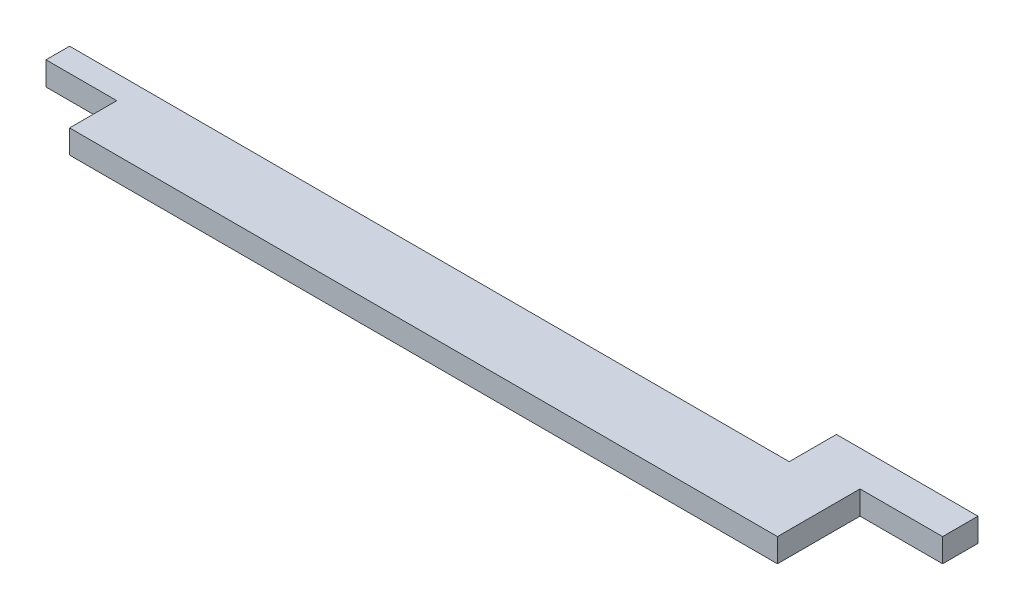
ISO-10303-21;
HEADER;
FILE_DESCRIPTION(('STEP AP214'),'2;1');
FILE_NAME('part.step','',(''),(''),'','','');
FILE_SCHEMA(('AUTOMOTIVE_DESIGN { 1 0 10303 214 1 1 1 1 }'));
ENDSEC;
DATA;
#1=APPLICATION_CONTEXT('core data for automotive mechanical design processes');
#2=APPLICATION_PROTOCOL_DEFINITION('international standard','automotive_design',2000,#1);
#3=PRODUCT_CONTEXT('',#1,'mechanical');
#4=PRODUCT('Part','Part','',(#3));
#5=PRODUCT_RELATED_PRODUCT_CATEGORY('part','',(#4));
#6=PRODUCT_DEFINITION_FORMATION('','',#4);
#7=PRODUCT_DEFINITION_CONTEXT('part definition',#1,'design');
#8=PRODUCT_DEFINITION('design','',#6,#7);
#9=PRODUCT_DEFINITION_SHAPE('','',#8);
#10=(LENGTH_UNIT() NAMED_UNIT(*) SI_UNIT(.MILLI.,.METRE.));
#11=(NAMED_UNIT(*) PLANE_ANGLE_UNIT() SI_UNIT($,.RADIAN.));
#12=(NAMED_UNIT(*) SI_UNIT($,.STERADIAN.) SOLID_ANGLE_UNIT());
#13=UNCERTAINTY_MEASURE_WITH_UNIT(LENGTH_MEASURE(1.E-05),#10,'distance_accuracy_value','');
#14=(GEOMETRIC_REPRESENTATION_CONTEXT(3) GLOBAL_UNCERTAINTY_ASSIGNED_CONTEXT((#13)) GLOBAL_UNIT_ASSIGNED_CONTEXT((#10,
#11,#12)) REPRESENTATION_CONTEXT('',''));
#15=CARTESIAN_POINT('',(0.,0.,0.));
#16=DIRECTION('',(0.,0.,1.));
#17=DIRECTION('',(1.,0.,0.));
#18=AXIS2_PLACEMENT_3D('',#15,#16,#17);
#19=CARTESIAN_POINT('',(0.,0.,0.));
#20=DIRECTION('',(0.,0.,1.));
#21=DIRECTION('',(1.,0.,0.));
#22=AXIS2_PLACEMENT_3D('',#19,#20,#21);
#23=PLANE('',#22);
#24=DIRECTION('',(0.,1.,0.));
#25=VECTOR('',#24,1.);
#26=CARTESIAN_POINT('',(69.85,2.54,0.));
#27=LINE('',#26,#25);
#28=CARTESIAN_POINT('',(69.85,0.,0.));
#29=VERTEX_POINT('',#28);
#30=CARTESIAN_POINT('',(69.85,2.54,0.));
#31=VERTEX_POINT('',#30);
#32=EDGE_CURVE('E69',#29,#31,#27,.T.);
#33=ORIENTED_EDGE('',*,*,#32,.F.);
#34=DIRECTION('',(1.,0.,0.));
#35=VECTOR('',#34,1.);
#36=CARTESIAN_POINT('',(0.,0.,0.));
#37=LINE('',#36,#35);
#38=CARTESIAN_POINT('',(-7.62,0.,0.));
#39=VERTEX_POINT('',#38);
#40=EDGE_CURVE('E205',#39,#29,#37,.T.);
#41=ORIENTED_EDGE('',*,*,#40,.F.);
#42=DIRECTION('',(0.,-1.,0.));
#43=VECTOR('',#42,1.);
#44=CARTESIAN_POINT('',(-7.62,2.54,0.));
#45=LINE('',#44,#43);
#46=CARTESIAN_POINT('',(-7.62,2.54,0.));
#47=VERTEX_POINT('',#46);
#48=EDGE_CURVE('E180',#47,#39,#45,.T.);
#49=ORIENTED_EDGE('',*,*,#48,.F.);
#50=DIRECTION('',(-1.,0.,0.));
#51=VECTOR('',#50,1.);
#52=CARTESIAN_POINT('',(0.,2.54,0.));
#53=LINE('',#52,#51);
#54=EDGE_CURVE('E211',#31,#47,#53,.T.);
#55=ORIENTED_EDGE('',*,*,#54,.F.);
#56=EDGE_LOOP('',(#33,#41,#49,#55));
#57=FACE_BOUND('',#56,.T.);
#58=ADVANCED_FACE('F45',(#57),#23,.F.);
#59=CARTESIAN_POINT('',(0.,2.54,7.62));
#60=DIRECTION('',(1.,0.,0.));
#61=DIRECTION('',(0.,1.,0.));
#62=AXIS2_PLACEMENT_3D('',#59,#60,#61);
#63=PLANE('',#62);
#64=DIRECTION('',(0.,1.,0.));
#65=VECTOR('',#64,1.);
#66=CARTESIAN_POINT('',(0.,2.54,2.54));
#67=LINE('',#66,#65);
#68=CARTESIAN_POINT('',(0.,0.,2.54));
#69=VERTEX_POINT('',#68);
#70=CARTESIAN_POINT('',(0.,2.54,2.54));
#71=VERTEX_POINT('',#70);
#72=EDGE_CURVE('E179',#69,#71,#67,.T.);
#73=ORIENTED_EDGE('',*,*,#72,.F.);
#74=DIRECTION('',(0.,0.,-1.));
#75=VECTOR('',#74,1.);
#76=CARTESIAN_POINT('',(0.,0.,7.62));
#77=LINE('',#76,#75);
#78=CARTESIAN_POINT('',(0.,0.,7.62));
#79=VERTEX_POINT('',#78);
#80=EDGE_CURVE('E11',#79,#69,#77,.T.);
#81=ORIENTED_EDGE('',*,*,#80,.F.);
#82=DIRECTION('',(0.,-1.,0.));
#83=VECTOR('',#82,1.);
#84=CARTESIAN_POINT('',(0.,2.54,7.62));
#85=LINE('',#84,#83);
#86=CARTESIAN_POINT('',(0.,2.54,7.62));
#87=VERTEX_POINT('',#86);
#88=EDGE_CURVE('E206',#87,#79,#85,.T.);
#89=ORIENTED_EDGE('',*,*,#88,.F.);
#90=DIRECTION('',(0.,0.,-1.));
#91=VECTOR('',#90,1.);
#92=CARTESIAN_POINT('',(0.,2.54,7.62));
#93=LINE('',#92,#91);
#94=EDGE_CURVE('E219',#87,#71,#93,.T.);
#95=ORIENTED_EDGE('',*,*,#94,.T.);
#96=EDGE_LOOP('',(#73,#81,#89,#95));
#97=FACE_BOUND('',#96,.T.);
#98=ADVANCED_FACE('F47',(#97),#63,.F.);
#99=CARTESIAN_POINT('',(0.,0.,7.62));
#100=DIRECTION('',(0.,1.,0.));
#101=DIRECTION('',(0.,0.,1.));
#102=AXIS2_PLACEMENT_3D('',#99,#100,#101);
#103=PLANE('',#102);
#104=DIRECTION('',(1.,0.,0.));
#105=VECTOR('',#104,1.);
#106=CARTESIAN_POINT('',(73.3601936685753,0.,-1.27));
#107=LINE('',#106,#105);
#108=CARTESIAN_POINT('',(76.2,0.,-1.27));
#109=VERTEX_POINT('',#108);
#110=CARTESIAN_POINT('',(85.09,0.,-1.27));
#111=VERTEX_POINT('',#110);
#112=EDGE_CURVE('E61',#109,#111,#107,.T.);
#113=ORIENTED_EDGE('',*,*,#112,.F.);
#114=DIRECTION('',(0.,0.,-1.));
#115=VECTOR('',#114,1.);
#116=CARTESIAN_POINT('',(76.2,0.,7.62));
#117=LINE('',#116,#115);
#118=CARTESIAN_POINT('',(76.2,0.,7.62));
#119=VERTEX_POINT('',#118);
#120=EDGE_CURVE('E54',#119,#109,#117,.T.);
#121=ORIENTED_EDGE('',*,*,#120,.F.);
#122=DIRECTION('',(1.,0.,0.));
#123=VECTOR('',#122,1.);
#124=CARTESIAN_POINT('',(0.,0.,7.62));
#125=LINE('',#124,#123);
#126=EDGE_CURVE('E210',#79,#119,#125,.T.);
#127=ORIENTED_EDGE('',*,*,#126,.F.);
#128=ORIENTED_EDGE('',*,*,#80,.T.);
#129=DIRECTION('',(1.,0.,0.));
#130=VECTOR('',#129,1.);
#131=CARTESIAN_POINT('',(-7.62,0.,2.54));
#132=LINE('',#131,#130);
#133=CARTESIAN_POINT('',(-7.62,0.,2.54));
#134=VERTEX_POINT('',#133);
#135=EDGE_CURVE('E201',#134,#69,#132,.T.);
#136=ORIENTED_EDGE('',*,*,#135,.F.);
#137=DIRECTION('',(0.,0.,1.));
#138=VECTOR('',#137,1.);
#139=CARTESIAN_POINT('',(-7.62,0.,0.));
#140=LINE('',#139,#138);
#141=EDGE_CURVE('E184',#39,#134,#140,.T.);
#142=ORIENTED_EDGE('',*,*,#141,.F.);
#143=ORIENTED_EDGE('',*,*,#40,.T.);
#144=DIRECTION('',(0.,0.,1.));
#145=VECTOR('',#144,1.);
#146=CARTESIAN_POINT('',(69.85,0.,-5.08));
#147=LINE('',#146,#145);
#148=CARTESIAN_POINT('',(69.85,0.,-5.08));
#149=VERTEX_POINT('',#148);
#150=EDGE_CURVE('E163',#149,#29,#147,.T.);
#151=ORIENTED_EDGE('',*,*,#150,.F.);
#152=DIRECTION('',(-1.,0.,0.));
#153=VECTOR('',#152,1.);
#154=CARTESIAN_POINT('',(69.85,0.,-5.08));
#155=LINE('',#154,#153);
#156=CARTESIAN_POINT('',(85.09,0.,-5.08));
#157=VERTEX_POINT('',#156);
#158=EDGE_CURVE('E160',#157,#149,#155,.T.);
#159=ORIENTED_EDGE('',*,*,#158,.F.);
#160=DIRECTION('',(0.,0.,1.));
#161=VECTOR('',#160,1.);
#162=CARTESIAN_POINT('',(85.09,0.,-5.08));
#163=LINE('',#162,#161);
#164=EDGE_CURVE('E142',#157,#111,#163,.T.);
#165=ORIENTED_EDGE('',*,*,#164,.T.);
#166=EDGE_LOOP('',(#113,#121,#127,#128,#136,#142,#143,#151,#159,#165));
#167=FACE_BOUND('',#166,.T.);
#168=ADVANCED_FACE('F139',(#167),#103,.F.);
#169=CARTESIAN_POINT('',(76.2,2.54,7.62));
#170=DIRECTION('',(-1.,0.,0.));
#171=DIRECTION('',(0.,0.,1.));
#172=AXIS2_PLACEMENT_3D('',#169,#170,#171);
#173=PLANE('',#172);
#174=ORIENTED_EDGE('',*,*,#120,.T.);
#175=DIRECTION('',(0.,1.,0.));
#176=VECTOR('',#175,1.);
#177=CARTESIAN_POINT('',(76.2,2.54,-1.27));
#178=LINE('',#177,#176);
#179=CARTESIAN_POINT('',(76.2,2.54,-1.27));
#180=VERTEX_POINT('',#179);
#181=EDGE_CURVE('E127',#109,#180,#178,.T.);
#182=ORIENTED_EDGE('',*,*,#181,.T.);
#183=DIRECTION('',(0.,0.,-1.));
#184=VECTOR('',#183,1.);
#185=CARTESIAN_POINT('',(76.2,2.54,7.62));
#186=LINE('',#185,#184);
#187=CARTESIAN_POINT('',(76.2,2.54,7.62));
#188=VERTEX_POINT('',#187);
#189=EDGE_CURVE('E131',#188,#180,#186,.T.);
#190=ORIENTED_EDGE('',*,*,#189,.F.);
#191=DIRECTION('',(0.,1.,0.));
#192=VECTOR('',#191,1.);
#193=CARTESIAN_POINT('',(76.2,2.54,7.62));
#194=LINE('',#193,#192);
#195=EDGE_CURVE('E128',#119,#188,#194,.T.);
#196=ORIENTED_EDGE('',*,*,#195,.F.);
#197=EDGE_LOOP('',(#174,#182,#190,#196));
#198=FACE_BOUND('',#197,.T.);
#199=ADVANCED_FACE('F125',(#198),#173,.F.);
#200=CARTESIAN_POINT('',(0.,2.54,7.62));
#201=DIRECTION('',(0.,-1.,0.));
#202=DIRECTION('',(0.,0.,-1.));
#203=AXIS2_PLACEMENT_3D('',#200,#201,#202);
#204=PLANE('',#203);
#205=ORIENTED_EDGE('',*,*,#189,.T.);
#206=DIRECTION('',(1.,0.,0.));
#207=VECTOR('',#206,1.);
#208=CARTESIAN_POINT('',(73.3601936685753,2.54,-1.27));
#209=LINE('',#208,#207);
#210=CARTESIAN_POINT('',(85.09,2.54,-1.27));
#211=VERTEX_POINT('',#210);
#212=EDGE_CURVE('E135',#180,#211,#209,.T.);
#213=ORIENTED_EDGE('',*,*,#212,.T.);
#214=DIRECTION('',(0.,0.,1.));
#215=VECTOR('',#214,1.);
#216=CARTESIAN_POINT('',(85.09,2.54,-5.08));
#217=LINE('',#216,#215);
#218=CARTESIAN_POINT('',(85.09,2.54,-5.08));
#219=VERTEX_POINT('',#218);
#220=EDGE_CURVE('E171',#219,#211,#217,.T.);
#221=ORIENTED_EDGE('',*,*,#220,.F.);
#222=DIRECTION('',(1.,0.,0.));
#223=VECTOR('',#222,1.);
#224=CARTESIAN_POINT('',(69.85,2.54,-5.08));
#225=LINE('',#224,#223);
#226=CARTESIAN_POINT('',(69.85,2.54,-5.08));
#227=VERTEX_POINT('',#226);
#228=EDGE_CURVE('E154',#227,#219,#225,.T.);
#229=ORIENTED_EDGE('',*,*,#228,.F.);
#230=DIRECTION('',(0.,0.,1.));
#231=VECTOR('',#230,1.);
#232=CARTESIAN_POINT('',(69.85,2.54,-5.08));
#233=LINE('',#232,#231);
#234=EDGE_CURVE('E175',#227,#31,#233,.T.);
#235=ORIENTED_EDGE('',*,*,#234,.T.);
#236=ORIENTED_EDGE('',*,*,#54,.T.);
#237=DIRECTION('',(0.,0.,-1.));
#238=VECTOR('',#237,1.);
#239=CARTESIAN_POINT('',(-7.62,2.54,0.));
#240=LINE('',#239,#238);
#241=CARTESIAN_POINT('',(-7.62,2.54,2.54));
#242=VERTEX_POINT('',#241);
#243=EDGE_CURVE('E190',#242,#47,#240,.T.);
#244=ORIENTED_EDGE('',*,*,#243,.F.);
#245=DIRECTION('',(1.,0.,0.));
#246=VECTOR('',#245,1.);
#247=CARTESIAN_POINT('',(-7.62,2.54,2.54));
#248=LINE('',#247,#246);
#249=EDGE_CURVE('E194',#242,#71,#248,.T.);
#250=ORIENTED_EDGE('',*,*,#249,.T.);
#251=ORIENTED_EDGE('',*,*,#94,.F.);
#252=DIRECTION('',(-1.,0.,0.));
#253=VECTOR('',#252,1.);
#254=CARTESIAN_POINT('',(0.,2.54,7.62));
#255=LINE('',#254,#253);
#256=EDGE_CURVE('E216',#188,#87,#255,.T.);
#257=ORIENTED_EDGE('',*,*,#256,.F.);
#258=EDGE_LOOP('',(#205,#213,#221,#229,#235,#236,#244,#250,#251,#257));
#259=FACE_BOUND('',#258,.T.);
#260=ADVANCED_FACE('F229',(#259),#204,.F.);
#261=CARTESIAN_POINT('',(0.,0.,7.62));
#262=DIRECTION('',(0.,0.,1.));
#263=DIRECTION('',(1.,0.,0.));
#264=AXIS2_PLACEMENT_3D('',#261,#262,#263);
#265=PLANE('',#264);
#266=ORIENTED_EDGE('',*,*,#88,.T.);
#267=ORIENTED_EDGE('',*,*,#126,.T.);
#268=ORIENTED_EDGE('',*,*,#195,.T.);
#269=ORIENTED_EDGE('',*,*,#256,.T.);
#270=EDGE_LOOP('',(#266,#267,#268,#269));
#271=FACE_BOUND('',#270,.T.);
#272=ADVANCED_FACE('F234',(#271),#265,.T.);
#273=CARTESIAN_POINT('',(-7.62,2.54,2.54));
#274=DIRECTION('',(0.,0.,-1.));
#275=DIRECTION('',(-1.,0.,0.));
#276=AXIS2_PLACEMENT_3D('',#273,#274,#275);
#277=PLANE('',#276);
#278=ORIENTED_EDGE('',*,*,#72,.T.);
#279=ORIENTED_EDGE('',*,*,#249,.F.);
#280=DIRECTION('',(0.,1.,0.));
#281=VECTOR('',#280,1.);
#282=CARTESIAN_POINT('',(-7.62,2.54,2.54));
#283=LINE('',#282,#281);
#284=EDGE_CURVE('E187',#134,#242,#283,.T.);
#285=ORIENTED_EDGE('',*,*,#284,.F.);
#286=ORIENTED_EDGE('',*,*,#135,.T.);
#287=EDGE_LOOP('',(#278,#279,#285,#286));
#288=FACE_BOUND('',#287,.T.);
#289=ADVANCED_FACE('F241',(#288),#277,.F.);
#290=CARTESIAN_POINT('',(-7.62,0.,0.));
#291=DIRECTION('',(-1.,0.,0.));
#292=DIRECTION('',(0.,-1.,0.));
#293=AXIS2_PLACEMENT_3D('',#290,#291,#292);
#294=PLANE('',#293);
#295=ORIENTED_EDGE('',*,*,#48,.T.);
#296=ORIENTED_EDGE('',*,*,#141,.T.);
#297=ORIENTED_EDGE('',*,*,#284,.T.);
#298=ORIENTED_EDGE('',*,*,#243,.T.);
#299=EDGE_LOOP('',(#295,#296,#297,#298));
#300=FACE_BOUND('',#299,.T.);
#301=ADVANCED_FACE('F245',(#300),#294,.T.);
#302=CARTESIAN_POINT('',(69.85,2.54,-5.08));
#303=DIRECTION('',(1.,0.,0.));
#304=DIRECTION('',(0.,0.,-1.));
#305=AXIS2_PLACEMENT_3D('',#302,#303,#304);
#306=PLANE('',#305);
#307=ORIENTED_EDGE('',*,*,#32,.T.);
#308=ORIENTED_EDGE('',*,*,#234,.F.);
#309=DIRECTION('',(0.,1.,0.));
#310=VECTOR('',#309,1.);
#311=CARTESIAN_POINT('',(69.85,2.54,-5.08));
#312=LINE('',#311,#310);
#313=EDGE_CURVE('E150',#149,#227,#312,.T.);
#314=ORIENTED_EDGE('',*,*,#313,.F.);
#315=ORIENTED_EDGE('',*,*,#150,.T.);
#316=EDGE_LOOP('',(#307,#308,#314,#315));
#317=FACE_BOUND('',#316,.T.);
#318=ADVANCED_FACE('F250',(#317),#306,.F.);
#319=CARTESIAN_POINT('',(85.09,2.54,-5.08));
#320=DIRECTION('',(-1.,0.,0.));
#321=DIRECTION('',(0.,0.,1.));
#322=AXIS2_PLACEMENT_3D('',#319,#320,#321);
#323=PLANE('',#322);
#324=ORIENTED_EDGE('',*,*,#220,.T.);
#325=DIRECTION('',(0.,1.,0.));
#326=VECTOR('',#325,1.);
#327=CARTESIAN_POINT('',(85.09,2.54,-1.27));
#328=LINE('',#327,#326);
#329=EDGE_CURVE('E144',#111,#211,#328,.T.);
#330=ORIENTED_EDGE('',*,*,#329,.F.);
#331=ORIENTED_EDGE('',*,*,#164,.F.);
#332=DIRECTION('',(0.,-1.,0.));
#333=VECTOR('',#332,1.);
#334=CARTESIAN_POINT('',(85.09,2.54,-5.08));
#335=LINE('',#334,#333);
#336=EDGE_CURVE('E157',#219,#157,#335,.T.);
#337=ORIENTED_EDGE('',*,*,#336,.F.);
#338=EDGE_LOOP('',(#324,#330,#331,#337));
#339=FACE_BOUND('',#338,.T.);
#340=ADVANCED_FACE('F256',(#339),#323,.F.);
#341=CARTESIAN_POINT('',(0.,0.,-5.08));
#342=DIRECTION('',(0.,0.,1.));
#343=DIRECTION('',(1.,0.,0.));
#344=AXIS2_PLACEMENT_3D('',#341,#342,#343);
#345=PLANE('',#344);
#346=ORIENTED_EDGE('',*,*,#313,.T.);
#347=ORIENTED_EDGE('',*,*,#228,.T.);
#348=ORIENTED_EDGE('',*,*,#336,.T.);
#349=ORIENTED_EDGE('',*,*,#158,.T.);
#350=EDGE_LOOP('',(#346,#347,#348,#349));
#351=FACE_BOUND('',#350,.T.);
#352=ADVANCED_FACE('F253',(#351),#345,.F.);
#353=CARTESIAN_POINT('',(73.3601936685753,2.54,-1.27));
#354=DIRECTION('',(0.,0.,-1.));
#355=DIRECTION('',(0.,1.,0.));
#356=AXIS2_PLACEMENT_3D('',#353,#354,#355);
#357=PLANE('',#356);
#358=ORIENTED_EDGE('',*,*,#112,.T.);
#359=ORIENTED_EDGE('',*,*,#329,.T.);
#360=ORIENTED_EDGE('',*,*,#212,.F.);
#361=ORIENTED_EDGE('',*,*,#181,.F.);
#362=EDGE_LOOP('',(#358,#359,#360,#361));
#363=FACE_BOUND('',#362,.T.);
#364=ADVANCED_FACE('F133',(#363),#357,.F.);
#365=CLOSED_SHELL('',(#58,#98,#168,#199,#260,#272,#289,#301,#318,#340,#352,#364));
#366=MANIFOLD_SOLID_BREP('B2',#365);
#367=ADVANCED_BREP_SHAPE_REPRESENTATION('',(#18,#366),#14);
#368=SHAPE_DEFINITION_REPRESENTATION(#9,#367);
ENDSEC;
END-ISO-10303-21;
